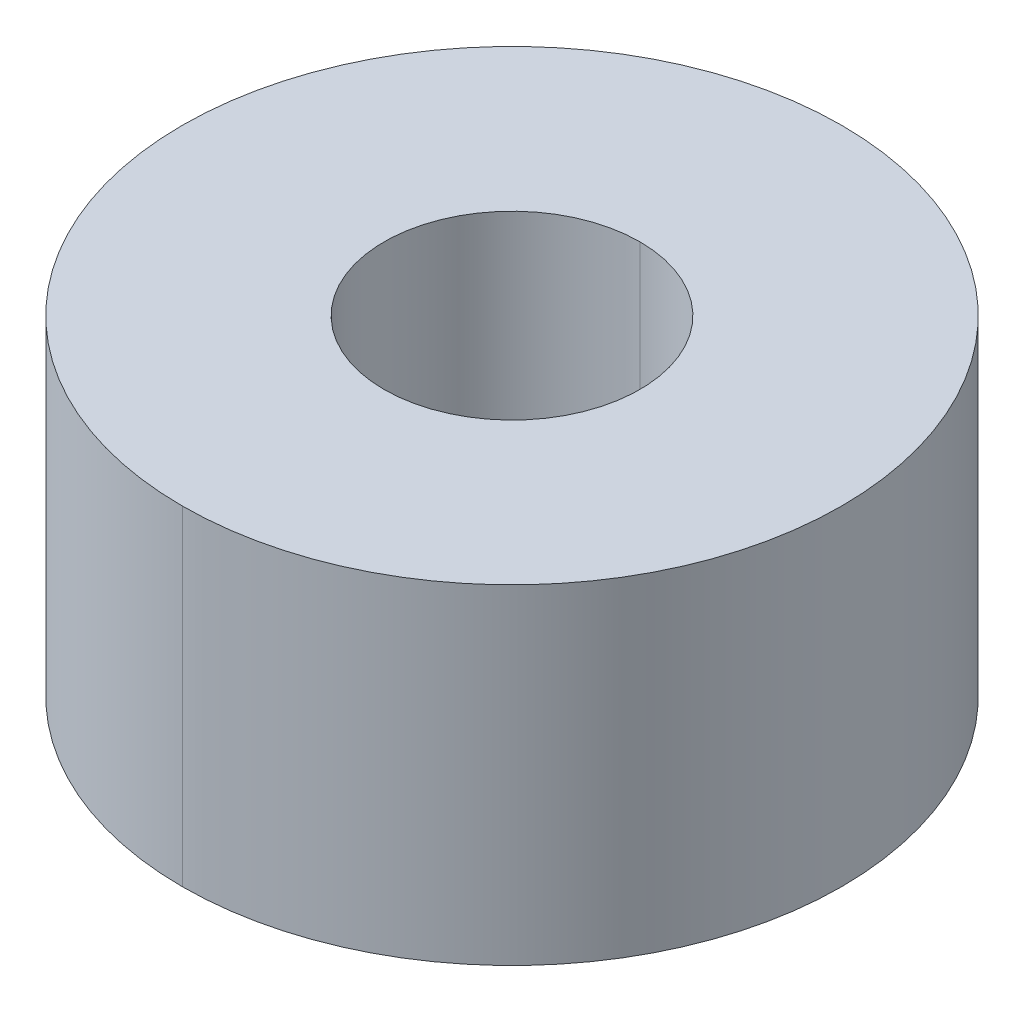
ISO-10303-21;
HEADER;
FILE_DESCRIPTION(('STEP AP214'),'2;1');
FILE_NAME('part.step','',(''),(''),'','','');
FILE_SCHEMA(('AUTOMOTIVE_DESIGN { 1 0 10303 214 1 1 1 1 }'));
ENDSEC;
DATA;
#1=APPLICATION_CONTEXT('core data for automotive mechanical design processes');
#2=APPLICATION_PROTOCOL_DEFINITION('international standard','automotive_design',2000,#1);
#3=PRODUCT_CONTEXT('',#1,'mechanical');
#4=PRODUCT('Part','Part','',(#3));
#5=PRODUCT_RELATED_PRODUCT_CATEGORY('part','',(#4));
#6=PRODUCT_DEFINITION_FORMATION('','',#4);
#7=PRODUCT_DEFINITION_CONTEXT('part definition',#1,'design');
#8=PRODUCT_DEFINITION('design','',#6,#7);
#9=PRODUCT_DEFINITION_SHAPE('','',#8);
#10=(LENGTH_UNIT() NAMED_UNIT(*) SI_UNIT(.MILLI.,.METRE.));
#11=(NAMED_UNIT(*) PLANE_ANGLE_UNIT() SI_UNIT($,.RADIAN.));
#12=(NAMED_UNIT(*) SI_UNIT($,.STERADIAN.) SOLID_ANGLE_UNIT());
#13=UNCERTAINTY_MEASURE_WITH_UNIT(LENGTH_MEASURE(1.E-05),#10,'distance_accuracy_value','');
#14=(GEOMETRIC_REPRESENTATION_CONTEXT(3) GLOBAL_UNCERTAINTY_ASSIGNED_CONTEXT((#13)) GLOBAL_UNIT_ASSIGNED_CONTEXT((#10,
#11,#12)) REPRESENTATION_CONTEXT('',''));
#15=CARTESIAN_POINT('',(0.,0.,0.));
#16=DIRECTION('',(0.,0.,1.));
#17=DIRECTION('',(1.,0.,0.));
#18=AXIS2_PLACEMENT_3D('',#15,#16,#17);
#19=CARTESIAN_POINT('',(0.,3.175,0.));
#20=DIRECTION('',(0.,-1.,0.));
#21=DIRECTION('',(0.,0.,-1.));
#22=AXIS2_PLACEMENT_3D('',#19,#20,#21);
#23=CYLINDRICAL_SURFACE('',#22,2.4638);
#24=CARTESIAN_POINT('',(0.,3.175,0.));
#25=DIRECTION('',(0.,1.,0.));
#26=DIRECTION('',(0.,0.,1.));
#27=AXIS2_PLACEMENT_3D('',#24,#25,#26);
#28=CIRCLE('',#27,2.4638);
#29=CARTESIAN_POINT('',(0.,3.175,-2.4638));
#30=VERTEX_POINT('',#29);
#31=CARTESIAN_POINT('',(0.,3.175,2.4638));
#32=VERTEX_POINT('',#31);
#33=EDGE_CURVE('E78',#30,#32,#28,.T.);
#34=ORIENTED_EDGE('',*,*,#33,.T.);
#35=DIRECTION('',(0.,-1.,0.));
#36=VECTOR('',#35,1.);
#37=CARTESIAN_POINT('',(0.,3.175,2.4638));
#38=LINE('',#37,#36);
#39=CARTESIAN_POINT('',(0.,-3.175,2.4638));
#40=VERTEX_POINT('',#39);
#41=EDGE_CURVE('E26',#32,#40,#38,.T.);
#42=ORIENTED_EDGE('',*,*,#41,.T.);
#43=CARTESIAN_POINT('',(0.,-3.175,0.));
#44=DIRECTION('',(0.,1.,0.));
#45=DIRECTION('',(0.,0.,1.));
#46=AXIS2_PLACEMENT_3D('',#43,#44,#45);
#47=CIRCLE('',#46,2.4638);
#48=CARTESIAN_POINT('',(0.,-3.175,-2.4638));
#49=VERTEX_POINT('',#48);
#50=EDGE_CURVE('E96',#49,#40,#47,.T.);
#51=ORIENTED_EDGE('',*,*,#50,.F.);
#52=DIRECTION('',(0.,-1.,0.));
#53=VECTOR('',#52,1.);
#54=CARTESIAN_POINT('',(0.,3.175,-2.4638));
#55=LINE('',#54,#53);
#56=EDGE_CURVE('E10',#30,#49,#55,.T.);
#57=ORIENTED_EDGE('',*,*,#56,.F.);
#58=EDGE_LOOP('',(#34,#42,#51,#57));
#59=FACE_BOUND('',#58,.T.);
#60=ADVANCED_FACE('F15',(#59),#23,.F.);
#61=CARTESIAN_POINT('',(0.,3.175,0.));
#62=DIRECTION('',(0.,-1.,0.));
#63=DIRECTION('',(0.,0.,-1.));
#64=AXIS2_PLACEMENT_3D('',#61,#62,#63);
#65=CYLINDRICAL_SURFACE('',#64,2.4638);
#66=ORIENTED_EDGE('',*,*,#41,.F.);
#67=CARTESIAN_POINT('',(0.,3.175,0.));
#68=DIRECTION('',(0.,1.,0.));
#69=DIRECTION('',(0.,0.,1.));
#70=AXIS2_PLACEMENT_3D('',#67,#68,#69);
#71=CIRCLE('',#70,2.4638);
#72=EDGE_CURVE('E19',#32,#30,#71,.T.);
#73=ORIENTED_EDGE('',*,*,#72,.T.);
#74=ORIENTED_EDGE('',*,*,#56,.T.);
#75=CARTESIAN_POINT('',(0.,-3.175,0.));
#76=DIRECTION('',(0.,1.,0.));
#77=DIRECTION('',(0.,0.,1.));
#78=AXIS2_PLACEMENT_3D('',#75,#76,#77);
#79=CIRCLE('',#78,2.4638);
#80=EDGE_CURVE('E79',#40,#49,#79,.T.);
#81=ORIENTED_EDGE('',*,*,#80,.F.);
#82=EDGE_LOOP('',(#66,#73,#74,#81));
#83=FACE_BOUND('',#82,.T.);
#84=ADVANCED_FACE('F17',(#83),#65,.F.);
#85=CARTESIAN_POINT('',(0.,3.175,0.));
#86=DIRECTION('',(0.,-1.,0.));
#87=DIRECTION('',(0.,0.,-1.));
#88=AXIS2_PLACEMENT_3D('',#85,#86,#87);
#89=CYLINDRICAL_SURFACE('',#88,6.35);
#90=CARTESIAN_POINT('',(0.,3.175,0.));
#91=DIRECTION('',(0.,1.,0.));
#92=DIRECTION('',(0.,0.,1.));
#93=AXIS2_PLACEMENT_3D('',#90,#91,#92);
#94=CIRCLE('',#93,6.35);
#95=CARTESIAN_POINT('',(0.,3.175,6.35));
#96=VERTEX_POINT('',#95);
#97=CARTESIAN_POINT('',(0.,3.175,-6.35));
#98=VERTEX_POINT('',#97);
#99=EDGE_CURVE('E68',#96,#98,#94,.T.);
#100=ORIENTED_EDGE('',*,*,#99,.F.);
#101=DIRECTION('',(0.,-1.,0.));
#102=VECTOR('',#101,1.);
#103=CARTESIAN_POINT('',(0.,3.175,6.35));
#104=LINE('',#103,#102);
#105=CARTESIAN_POINT('',(0.,-3.175,6.35));
#106=VERTEX_POINT('',#105);
#107=EDGE_CURVE('E72',#96,#106,#104,.T.);
#108=ORIENTED_EDGE('',*,*,#107,.T.);
#109=CARTESIAN_POINT('',(0.,-3.175,0.));
#110=DIRECTION('',(0.,1.,0.));
#111=DIRECTION('',(0.,0.,1.));
#112=AXIS2_PLACEMENT_3D('',#109,#110,#111);
#113=CIRCLE('',#112,6.35);
#114=CARTESIAN_POINT('',(0.,-3.175,-6.35));
#115=VERTEX_POINT('',#114);
#116=EDGE_CURVE('E100',#106,#115,#113,.T.);
#117=ORIENTED_EDGE('',*,*,#116,.T.);
#118=DIRECTION('',(0.,-1.,0.));
#119=VECTOR('',#118,1.);
#120=CARTESIAN_POINT('',(0.,3.175,-6.35));
#121=LINE('',#120,#119);
#122=EDGE_CURVE('E74',#98,#115,#121,.T.);
#123=ORIENTED_EDGE('',*,*,#122,.F.);
#124=EDGE_LOOP('',(#100,#108,#117,#123));
#125=FACE_BOUND('',#124,.T.);
#126=ADVANCED_FACE('F70',(#125),#89,.T.);
#127=CARTESIAN_POINT('',(0.,3.175,0.));
#128=DIRECTION('',(0.,1.,0.));
#129=DIRECTION('',(1.,0.,0.));
#130=AXIS2_PLACEMENT_3D('',#127,#128,#129);
#131=PLANE('',#130);
#132=ORIENTED_EDGE('',*,*,#33,.F.);
#133=ORIENTED_EDGE('',*,*,#72,.F.);
#134=EDGE_LOOP('',(#132,#133));
#135=FACE_BOUND('',#134,.T.);
#136=CARTESIAN_POINT('',(0.,3.175,0.));
#137=DIRECTION('',(0.,1.,0.));
#138=DIRECTION('',(0.,0.,1.));
#139=AXIS2_PLACEMENT_3D('',#136,#137,#138);
#140=CIRCLE('',#139,6.35);
#141=EDGE_CURVE('E81',#98,#96,#140,.T.);
#142=ORIENTED_EDGE('',*,*,#141,.T.);
#143=ORIENTED_EDGE('',*,*,#99,.T.);
#144=EDGE_LOOP('',(#142,#143));
#145=FACE_BOUND('',#144,.T.);
#146=ADVANCED_FACE('F82',(#135,#145),#131,.T.);
#147=CARTESIAN_POINT('',(0.,-3.175,0.));
#148=DIRECTION('',(0.,1.,0.));
#149=DIRECTION('',(1.,0.,0.));
#150=AXIS2_PLACEMENT_3D('',#147,#148,#149);
#151=PLANE('',#150);
#152=ORIENTED_EDGE('',*,*,#50,.T.);
#153=ORIENTED_EDGE('',*,*,#80,.T.);
#154=EDGE_LOOP('',(#152,#153));
#155=FACE_BOUND('',#154,.T.);
#156=CARTESIAN_POINT('',(0.,-3.175,0.));
#157=DIRECTION('',(0.,1.,0.));
#158=DIRECTION('',(0.,0.,1.));
#159=AXIS2_PLACEMENT_3D('',#156,#157,#158);
#160=CIRCLE('',#159,6.35);
#161=EDGE_CURVE('E89',#115,#106,#160,.T.);
#162=ORIENTED_EDGE('',*,*,#161,.F.);
#163=ORIENTED_EDGE('',*,*,#116,.F.);
#164=EDGE_LOOP('',(#162,#163));
#165=FACE_BOUND('',#164,.T.);
#166=ADVANCED_FACE('F112',(#155,#165),#151,.F.);
#167=CARTESIAN_POINT('',(0.,3.175,0.));
#168=DIRECTION('',(0.,-1.,0.));
#169=DIRECTION('',(0.,0.,-1.));
#170=AXIS2_PLACEMENT_3D('',#167,#168,#169);
#171=CYLINDRICAL_SURFACE('',#170,6.35);
#172=ORIENTED_EDGE('',*,*,#107,.F.);
#173=ORIENTED_EDGE('',*,*,#141,.F.);
#174=ORIENTED_EDGE('',*,*,#122,.T.);
#175=ORIENTED_EDGE('',*,*,#161,.T.);
#176=EDGE_LOOP('',(#172,#173,#174,#175));
#177=FACE_BOUND('',#176,.T.);
#178=ADVANCED_FACE('F87',(#177),#171,.T.);
#179=CLOSED_SHELL('',(#60,#84,#126,#146,#166,#178));
#180=MANIFOLD_SOLID_BREP('B1',#179);
#181=ADVANCED_BREP_SHAPE_REPRESENTATION('',(#18,#180),#14);
#182=SHAPE_DEFINITION_REPRESENTATION(#9,#181);
ENDSEC;
END-ISO-10303-21;
